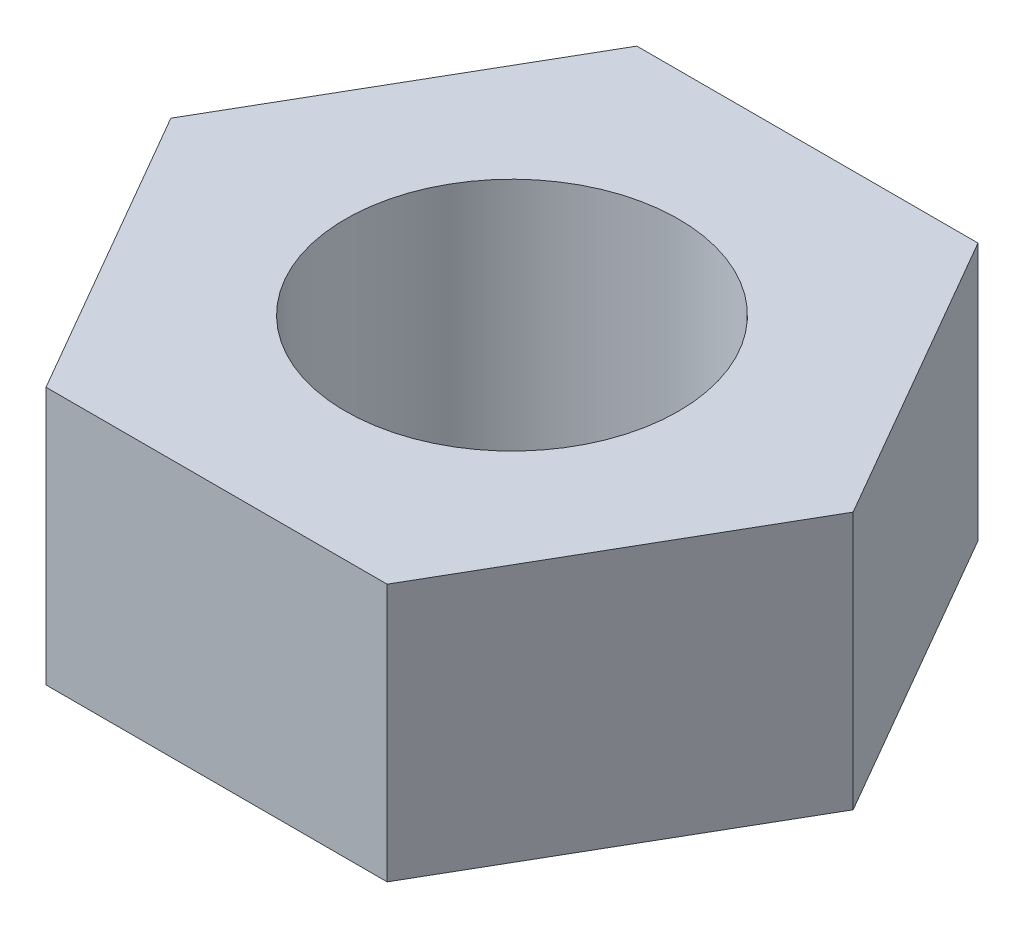
ISO-10303-21;
HEADER;
FILE_DESCRIPTION(('STEP AP214'),'2;1');
FILE_NAME('part.step','',(''),(''),'','','');
FILE_SCHEMA(('AUTOMOTIVE_DESIGN { 1 0 10303 214 1 1 1 1 }'));
ENDSEC;
DATA;
#1=APPLICATION_CONTEXT('core data for automotive mechanical design processes');
#2=APPLICATION_PROTOCOL_DEFINITION('international standard','automotive_design',2000,#1);
#3=PRODUCT_CONTEXT('',#1,'mechanical');
#4=PRODUCT('Part','Part','',(#3));
#5=PRODUCT_RELATED_PRODUCT_CATEGORY('part','',(#4));
#6=PRODUCT_DEFINITION_FORMATION('','',#4);
#7=PRODUCT_DEFINITION_CONTEXT('part definition',#1,'design');
#8=PRODUCT_DEFINITION('design','',#6,#7);
#9=PRODUCT_DEFINITION_SHAPE('','',#8);
#10=(LENGTH_UNIT() NAMED_UNIT(*) SI_UNIT(.MILLI.,.METRE.));
#11=(NAMED_UNIT(*) PLANE_ANGLE_UNIT() SI_UNIT($,.RADIAN.));
#12=(NAMED_UNIT(*) SI_UNIT($,.STERADIAN.) SOLID_ANGLE_UNIT());
#13=UNCERTAINTY_MEASURE_WITH_UNIT(LENGTH_MEASURE(1.E-05),#10,'distance_accuracy_value','');
#14=(GEOMETRIC_REPRESENTATION_CONTEXT(3) GLOBAL_UNCERTAINTY_ASSIGNED_CONTEXT((#13)) GLOBAL_UNIT_ASSIGNED_CONTEXT((#10,
#11,#12)) REPRESENTATION_CONTEXT('',''));
#15=CARTESIAN_POINT('',(0.,0.,0.));
#16=DIRECTION('',(0.,0.,1.));
#17=DIRECTION('',(1.,0.,0.));
#18=AXIS2_PLACEMENT_3D('',#15,#16,#17);
#19=CARTESIAN_POINT('',(0.,0.,0.));
#20=DIRECTION('',(0.,-1.,0.));
#21=DIRECTION('',(1.,0.,0.));
#22=AXIS2_PLACEMENT_3D('',#19,#20,#21);
#23=CYLINDRICAL_SURFACE('',#22,1.55);
#24=CARTESIAN_POINT('',(0.,0.,0.));
#25=DIRECTION('',(0.,-1.,0.));
#26=DIRECTION('',(1.,0.,0.));
#27=AXIS2_PLACEMENT_3D('',#24,#25,#26);
#28=CIRCLE('',#27,1.55);
#29=CARTESIAN_POINT('',(1.55,0.,0.));
#30=VERTEX_POINT('',#29);
#31=EDGE_CURVE('E102',#30,#30,#28,.T.);
#32=ORIENTED_EDGE('',*,*,#31,.T.);
#33=DIRECTION('',(0.,1.,0.));
#34=VECTOR('',#33,1.);
#35=CARTESIAN_POINT('',(1.55,0.,0.));
#36=LINE('',#35,#34);
#37=CARTESIAN_POINT('',(1.55,2.4,0.));
#38=VERTEX_POINT('',#37);
#39=EDGE_CURVE('E9',#30,#38,#36,.T.);
#40=ORIENTED_EDGE('',*,*,#39,.T.);
#41=CARTESIAN_POINT('',(0.,2.4,0.));
#42=DIRECTION('',(0.,-1.,0.));
#43=DIRECTION('',(1.,0.,0.));
#44=AXIS2_PLACEMENT_3D('',#41,#42,#43);
#45=CIRCLE('',#44,1.55);
#46=EDGE_CURVE('E86',#38,#38,#45,.T.);
#47=ORIENTED_EDGE('',*,*,#46,.F.);
#48=ORIENTED_EDGE('',*,*,#39,.F.);
#49=EDGE_LOOP('',(#32,#40,#47,#48));
#50=FACE_BOUND('',#49,.T.);
#51=ADVANCED_FACE('F15',(#50),#23,.F.);
#52=CARTESIAN_POINT('',(-3.175425,0.,0.));
#53=DIRECTION('',(-0.866025403784329,0.,-0.50000000000019));
#54=DIRECTION('',(-0.50000000000019,0.,0.866025403784329));
#55=AXIS2_PLACEMENT_3D('',#52,#53,#54);
#56=PLANE('',#55);
#57=DIRECTION('',(0.,1.,0.));
#58=VECTOR('',#57,1.);
#59=CARTESIAN_POINT('',(-3.175425,0.,0.));
#60=LINE('',#59,#58);
#61=CARTESIAN_POINT('',(-3.175425,0.,0.));
#62=VERTEX_POINT('',#61);
#63=CARTESIAN_POINT('',(-3.175425,2.4,0.));
#64=VERTEX_POINT('',#63);
#65=EDGE_CURVE('E24',#62,#64,#60,.T.);
#66=ORIENTED_EDGE('',*,*,#65,.T.);
#67=DIRECTION('',(0.50000000000019,0.,-0.866025403784329));
#68=VECTOR('',#67,1.);
#69=CARTESIAN_POINT('',(-3.175425,2.4,0.));
#70=LINE('',#69,#68);
#71=CARTESIAN_POINT('',(-1.5877125,2.4,-2.749998717812));
#72=VERTEX_POINT('',#71);
#73=EDGE_CURVE('E89',#64,#72,#70,.T.);
#74=ORIENTED_EDGE('',*,*,#73,.T.);
#75=DIRECTION('',(0.,1.,0.));
#76=VECTOR('',#75,1.);
#77=CARTESIAN_POINT('',(-1.5877125,0.,-2.749998717812));
#78=LINE('',#77,#76);
#79=CARTESIAN_POINT('',(-1.5877125,0.,-2.749998717812));
#80=VERTEX_POINT('',#79);
#81=EDGE_CURVE('E74',#80,#72,#78,.T.);
#82=ORIENTED_EDGE('',*,*,#81,.F.);
#83=DIRECTION('',(0.50000000000019,0.,-0.866025403784329));
#84=VECTOR('',#83,1.);
#85=CARTESIAN_POINT('',(-3.175425,0.,0.));
#86=LINE('',#85,#84);
#87=EDGE_CURVE('E248',#62,#80,#86,.T.);
#88=ORIENTED_EDGE('',*,*,#87,.F.);
#89=EDGE_LOOP('',(#66,#74,#82,#88));
#90=FACE_BOUND('',#89,.T.);
#91=ADVANCED_FACE('F90',(#90),#56,.T.);
#92=CARTESIAN_POINT('',(-1.5877125,0.,2.749998717812));
#93=DIRECTION('',(-0.866025403784329,0.,0.50000000000019));
#94=DIRECTION('',(0.,1.,0.));
#95=AXIS2_PLACEMENT_3D('',#92,#93,#94);
#96=PLANE('',#95);
#97=DIRECTION('',(0.,1.,0.));
#98=VECTOR('',#97,1.);
#99=CARTESIAN_POINT('',(-1.5877125,0.,2.749998717812));
#100=LINE('',#99,#98);
#101=CARTESIAN_POINT('',(-1.5877125,0.,2.749998717812));
#102=VERTEX_POINT('',#101);
#103=CARTESIAN_POINT('',(-1.5877125,2.4,2.749998717812));
#104=VERTEX_POINT('',#103);
#105=EDGE_CURVE('E214',#102,#104,#100,.T.);
#106=ORIENTED_EDGE('',*,*,#105,.T.);
#107=DIRECTION('',(-0.50000000000019,0.,-0.866025403784329));
#108=VECTOR('',#107,1.);
#109=CARTESIAN_POINT('',(-1.5877125,2.4,2.749998717812));
#110=LINE('',#109,#108);
#111=EDGE_CURVE('E94',#104,#64,#110,.T.);
#112=ORIENTED_EDGE('',*,*,#111,.T.);
#113=ORIENTED_EDGE('',*,*,#65,.F.);
#114=DIRECTION('',(-0.50000000000019,0.,-0.866025403784329));
#115=VECTOR('',#114,1.);
#116=CARTESIAN_POINT('',(-1.5877125,0.,2.749998717812));
#117=LINE('',#116,#115);
#118=EDGE_CURVE('E247',#102,#62,#117,.T.);
#119=ORIENTED_EDGE('',*,*,#118,.F.);
#120=EDGE_LOOP('',(#106,#112,#113,#119));
#121=FACE_BOUND('',#120,.T.);
#122=ADVANCED_FACE('F168',(#121),#96,.T.);
#123=CARTESIAN_POINT('',(-1.5877125,0.,-2.749998717812));
#124=DIRECTION('',(0.,0.,-1.));
#125=DIRECTION('',(-1.,0.,0.));
#126=AXIS2_PLACEMENT_3D('',#123,#124,#125);
#127=PLANE('',#126);
#128=ORIENTED_EDGE('',*,*,#81,.T.);
#129=DIRECTION('',(1.,0.,0.));
#130=VECTOR('',#129,1.);
#131=CARTESIAN_POINT('',(-1.5877125,2.4,-2.749998717812));
#132=LINE('',#131,#130);
#133=CARTESIAN_POINT('',(1.5877125,2.4,-2.749998717812));
#134=VERTEX_POINT('',#133);
#135=EDGE_CURVE('E79',#72,#134,#132,.T.);
#136=ORIENTED_EDGE('',*,*,#135,.T.);
#137=DIRECTION('',(0.,1.,0.));
#138=VECTOR('',#137,1.);
#139=CARTESIAN_POINT('',(1.5877125,0.,-2.749998717812));
#140=LINE('',#139,#138);
#141=CARTESIAN_POINT('',(1.5877125,0.,-2.749998717812));
#142=VERTEX_POINT('',#141);
#143=EDGE_CURVE('E236',#142,#134,#140,.T.);
#144=ORIENTED_EDGE('',*,*,#143,.F.);
#145=DIRECTION('',(1.,0.,0.));
#146=VECTOR('',#145,1.);
#147=CARTESIAN_POINT('',(-1.5877125,0.,-2.749998717812));
#148=LINE('',#147,#146);
#149=EDGE_CURVE('E81',#80,#142,#148,.T.);
#150=ORIENTED_EDGE('',*,*,#149,.F.);
#151=EDGE_LOOP('',(#128,#136,#144,#150));
#152=FACE_BOUND('',#151,.T.);
#153=ADVANCED_FACE('F76',(#152),#127,.T.);
#154=CARTESIAN_POINT('',(0.,2.4,0.));
#155=DIRECTION('',(0.,-1.,0.));
#156=DIRECTION('',(0.,0.,-1.));
#157=AXIS2_PLACEMENT_3D('',#154,#155,#156);
#158=PLANE('',#157);
#159=ORIENTED_EDGE('',*,*,#46,.T.);
#160=EDGE_LOOP('',(#159));
#161=FACE_BOUND('',#160,.T.);
#162=DIRECTION('',(0.50000000000019,0.,0.866025403784329));
#163=VECTOR('',#162,1.);
#164=CARTESIAN_POINT('',(1.5877125,2.4,-2.749998717812));
#165=LINE('',#164,#163);
#166=CARTESIAN_POINT('',(3.175425,2.4,0.));
#167=VERTEX_POINT('',#166);
#168=EDGE_CURVE('E99',#134,#167,#165,.T.);
#169=ORIENTED_EDGE('',*,*,#168,.F.);
#170=ORIENTED_EDGE('',*,*,#135,.F.);
#171=ORIENTED_EDGE('',*,*,#73,.F.);
#172=ORIENTED_EDGE('',*,*,#111,.F.);
#173=DIRECTION('',(-1.,0.,0.));
#174=VECTOR('',#173,1.);
#175=CARTESIAN_POINT('',(1.5877125,2.4,2.749998717812));
#176=LINE('',#175,#174);
#177=CARTESIAN_POINT('',(1.5877125,2.4,2.749998717812));
#178=VERTEX_POINT('',#177);
#179=EDGE_CURVE('E206',#178,#104,#176,.T.);
#180=ORIENTED_EDGE('',*,*,#179,.F.);
#181=DIRECTION('',(-0.50000000000019,0.,0.866025403784329));
#182=VECTOR('',#181,1.);
#183=CARTESIAN_POINT('',(3.175425,2.4,0.));
#184=LINE('',#183,#182);
#185=EDGE_CURVE('E209',#167,#178,#184,.T.);
#186=ORIENTED_EDGE('',*,*,#185,.F.);
#187=EDGE_LOOP('',(#169,#170,#171,#172,#180,#186));
#188=FACE_BOUND('',#187,.T.);
#189=ADVANCED_FACE('F96',(#161,#188),#158,.F.);
#190=CARTESIAN_POINT('',(0.,0.,0.));
#191=DIRECTION('',(0.,-1.,0.));
#192=DIRECTION('',(0.,0.,-1.));
#193=AXIS2_PLACEMENT_3D('',#190,#191,#192);
#194=PLANE('',#193);
#195=ORIENTED_EDGE('',*,*,#31,.F.);
#196=EDGE_LOOP('',(#195));
#197=FACE_BOUND('',#196,.T.);
#198=DIRECTION('',(-0.50000000000019,0.,0.866025403784329));
#199=VECTOR('',#198,1.);
#200=CARTESIAN_POINT('',(3.175425,0.,0.));
#201=LINE('',#200,#199);
#202=CARTESIAN_POINT('',(3.175425,0.,0.));
#203=VERTEX_POINT('',#202);
#204=CARTESIAN_POINT('',(1.5877125,0.,2.749998717812));
#205=VERTEX_POINT('',#204);
#206=EDGE_CURVE('E224',#203,#205,#201,.T.);
#207=ORIENTED_EDGE('',*,*,#206,.T.);
#208=DIRECTION('',(-1.,0.,0.));
#209=VECTOR('',#208,1.);
#210=CARTESIAN_POINT('',(1.5877125,0.,2.749998717812));
#211=LINE('',#210,#209);
#212=EDGE_CURVE('E220',#205,#102,#211,.T.);
#213=ORIENTED_EDGE('',*,*,#212,.T.);
#214=ORIENTED_EDGE('',*,*,#118,.T.);
#215=ORIENTED_EDGE('',*,*,#87,.T.);
#216=ORIENTED_EDGE('',*,*,#149,.T.);
#217=DIRECTION('',(0.50000000000019,0.,0.866025403784329));
#218=VECTOR('',#217,1.);
#219=CARTESIAN_POINT('',(1.5877125,0.,-2.749998717812));
#220=LINE('',#219,#218);
#221=EDGE_CURVE('E215',#142,#203,#220,.T.);
#222=ORIENTED_EDGE('',*,*,#221,.T.);
#223=EDGE_LOOP('',(#207,#213,#214,#215,#216,#222));
#224=FACE_BOUND('',#223,.T.);
#225=ADVANCED_FACE('F144',(#197,#224),#194,.T.);
#226=CARTESIAN_POINT('',(1.5877125,0.,2.749998717812));
#227=DIRECTION('',(0.,0.,1.));
#228=DIRECTION('',(1.,0.,0.));
#229=AXIS2_PLACEMENT_3D('',#226,#227,#228);
#230=PLANE('',#229);
#231=DIRECTION('',(0.,1.,0.));
#232=VECTOR('',#231,1.);
#233=CARTESIAN_POINT('',(1.5877125,0.,2.749998717812));
#234=LINE('',#233,#232);
#235=EDGE_CURVE('E218',#205,#178,#234,.T.);
#236=ORIENTED_EDGE('',*,*,#235,.T.);
#237=ORIENTED_EDGE('',*,*,#179,.T.);
#238=ORIENTED_EDGE('',*,*,#105,.F.);
#239=ORIENTED_EDGE('',*,*,#212,.F.);
#240=EDGE_LOOP('',(#236,#237,#238,#239));
#241=FACE_BOUND('',#240,.T.);
#242=ADVANCED_FACE('F134',(#241),#230,.T.);
#243=CARTESIAN_POINT('',(1.5877125,0.,-2.749998717812));
#244=DIRECTION('',(0.866025403784329,0.,-0.50000000000019));
#245=DIRECTION('',(0.,-1.,0.));
#246=AXIS2_PLACEMENT_3D('',#243,#244,#245);
#247=PLANE('',#246);
#248=ORIENTED_EDGE('',*,*,#143,.T.);
#249=ORIENTED_EDGE('',*,*,#168,.T.);
#250=DIRECTION('',(0.,1.,0.));
#251=VECTOR('',#250,1.);
#252=CARTESIAN_POINT('',(3.175425,0.,0.));
#253=LINE('',#252,#251);
#254=EDGE_CURVE('E227',#203,#167,#253,.T.);
#255=ORIENTED_EDGE('',*,*,#254,.F.);
#256=ORIENTED_EDGE('',*,*,#221,.F.);
#257=EDGE_LOOP('',(#248,#249,#255,#256));
#258=FACE_BOUND('',#257,.T.);
#259=ADVANCED_FACE('F124',(#258),#247,.T.);
#260=CARTESIAN_POINT('',(3.175425,0.,0.));
#261=DIRECTION('',(0.866025403784329,0.,0.50000000000019));
#262=DIRECTION('',(0.,-1.,0.));
#263=AXIS2_PLACEMENT_3D('',#260,#261,#262);
#264=PLANE('',#263);
#265=ORIENTED_EDGE('',*,*,#254,.T.);
#266=ORIENTED_EDGE('',*,*,#185,.T.);
#267=ORIENTED_EDGE('',*,*,#235,.F.);
#268=ORIENTED_EDGE('',*,*,#206,.F.);
#269=EDGE_LOOP('',(#265,#266,#267,#268));
#270=FACE_BOUND('',#269,.T.);
#271=ADVANCED_FACE('F119',(#270),#264,.T.);
#272=CLOSED_SHELL('',(#51,#91,#122,#153,#189,#225,#242,#259,#271));
#273=MANIFOLD_SOLID_BREP('B1',#272);
#274=ADVANCED_BREP_SHAPE_REPRESENTATION('',(#18,#273),#14);
#275=SHAPE_DEFINITION_REPRESENTATION(#9,#274);
ENDSEC;
END-ISO-10303-21;
